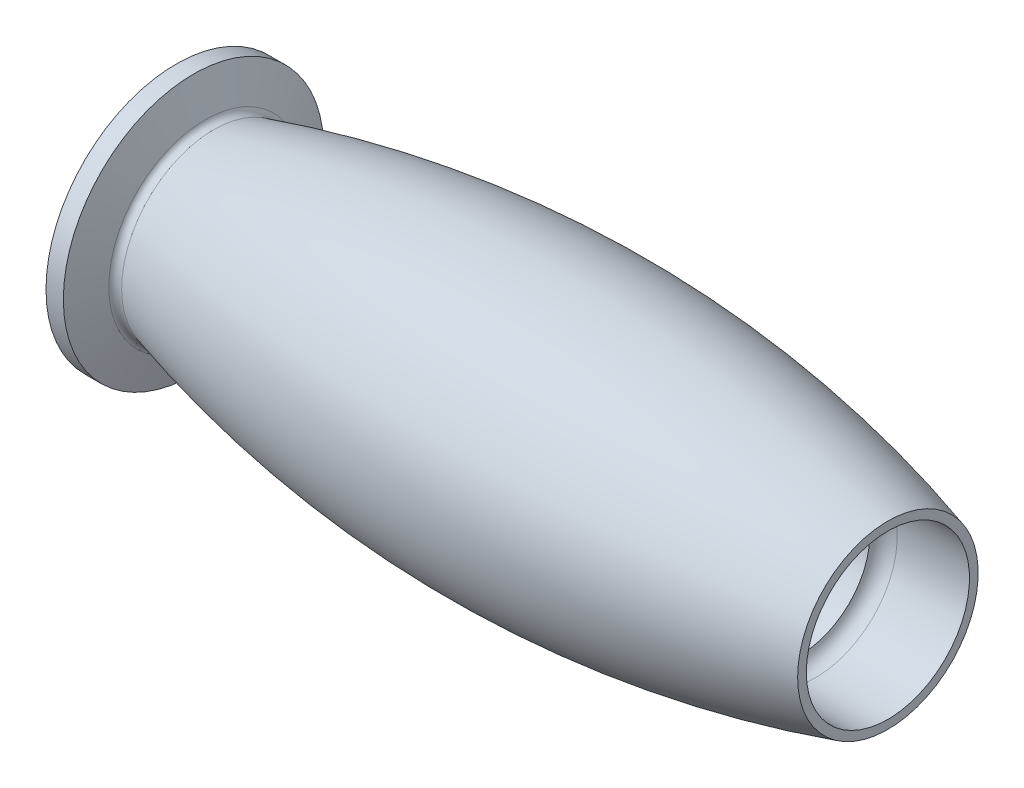
ISO-10303-21;
HEADER;
FILE_DESCRIPTION(('STEP AP214'),'2;1');
FILE_NAME('part.step','',(''),(''),'','','');
FILE_SCHEMA(('AUTOMOTIVE_DESIGN { 1 0 10303 214 1 1 1 1 }'));
ENDSEC;
DATA;
#1=APPLICATION_CONTEXT('core data for automotive mechanical design processes');
#2=APPLICATION_PROTOCOL_DEFINITION('international standard','automotive_design',2000,#1);
#3=PRODUCT_CONTEXT('',#1,'mechanical');
#4=PRODUCT('Part','Part','',(#3));
#5=PRODUCT_RELATED_PRODUCT_CATEGORY('part','',(#4));
#6=PRODUCT_DEFINITION_FORMATION('','',#4);
#7=PRODUCT_DEFINITION_CONTEXT('part definition',#1,'design');
#8=PRODUCT_DEFINITION('design','',#6,#7);
#9=PRODUCT_DEFINITION_SHAPE('','',#8);
#10=(LENGTH_UNIT() NAMED_UNIT(*) SI_UNIT(.MILLI.,.METRE.));
#11=(NAMED_UNIT(*) PLANE_ANGLE_UNIT() SI_UNIT($,.RADIAN.));
#12=(NAMED_UNIT(*) SI_UNIT($,.STERADIAN.) SOLID_ANGLE_UNIT());
#13=UNCERTAINTY_MEASURE_WITH_UNIT(LENGTH_MEASURE(1.E-05),#10,'distance_accuracy_value','');
#14=(GEOMETRIC_REPRESENTATION_CONTEXT(3) GLOBAL_UNCERTAINTY_ASSIGNED_CONTEXT((#13)) GLOBAL_UNIT_ASSIGNED_CONTEXT((#10,
#11,#12)) REPRESENTATION_CONTEXT('',''));
#15=CARTESIAN_POINT('',(0.,0.,0.));
#16=DIRECTION('',(0.,0.,1.));
#17=DIRECTION('',(1.,0.,0.));
#18=AXIS2_PLACEMENT_3D('',#15,#16,#17);
#19=CARTESIAN_POINT('',(-20.,0.,0.));
#20=DIRECTION('',(-1.,0.,0.));
#21=DIRECTION('',(0.,0.,1.));
#22=AXIS2_PLACEMENT_3D('',#19,#20,#21);
#23=CYLINDRICAL_SURFACE('',#22,12.);
#24=CARTESIAN_POINT('',(4.00000000000001,0.,0.));
#25=DIRECTION('',(-1.,0.,0.));
#26=DIRECTION('',(0.,0.,1.));
#27=AXIS2_PLACEMENT_3D('',#24,#25,#26);
#28=CIRCLE('',#27,12.);
#29=CARTESIAN_POINT('',(4.00000000000001,0.,12.));
#30=VERTEX_POINT('',#29);
#31=EDGE_CURVE('E43',#30,#30,#28,.T.);
#32=ORIENTED_EDGE('',*,*,#31,.T.);
#33=EDGE_LOOP('',(#32));
#34=FACE_BOUND('',#33,.T.);
#35=CARTESIAN_POINT('',(7.00000000000001,0.,0.));
#36=DIRECTION('',(-1.,0.,0.));
#37=DIRECTION('',(0.,0.,1.));
#38=AXIS2_PLACEMENT_3D('',#35,#36,#37);
#39=CIRCLE('',#38,12.);
#40=CARTESIAN_POINT('',(7.00000000000001,0.,12.));
#41=VERTEX_POINT('',#40);
#42=EDGE_CURVE('E81',#41,#41,#39,.T.);
#43=ORIENTED_EDGE('',*,*,#42,.F.);
#44=EDGE_LOOP('',(#43));
#45=FACE_BOUND('',#44,.T.);
#46=ADVANCED_FACE('F29',(#34,#45),#23,.F.);
#47=CARTESIAN_POINT('',(4.00000000000001,0.,0.));
#48=DIRECTION('',(1.,0.,0.));
#49=DIRECTION('',(0.,0.,-1.));
#50=AXIS2_PLACEMENT_3D('',#47,#48,#49);
#51=CONICAL_SURFACE('',#50,12.,1.21609067478396);
#52=CARTESIAN_POINT('',(6.50000000000001,0.,0.));
#53=DIRECTION('',(-1.,0.,0.));
#54=DIRECTION('',(0.,0.,1.));
#55=AXIS2_PLACEMENT_3D('',#52,#53,#54);
#56=CIRCLE('',#55,18.75);
#57=CARTESIAN_POINT('',(6.50000000000001,0.,18.75));
#58=VERTEX_POINT('',#57);
#59=EDGE_CURVE('E48',#58,#58,#56,.T.);
#60=ORIENTED_EDGE('',*,*,#59,.T.);
#61=EDGE_LOOP('',(#60));
#62=FACE_BOUND('',#61,.T.);
#63=ORIENTED_EDGE('',*,*,#31,.F.);
#64=EDGE_LOOP('',(#63));
#65=FACE_BOUND('',#64,.T.);
#66=ADVANCED_FACE('F89',(#62,#65),#51,.T.);
#67=CARTESIAN_POINT('',(-20.,0.,0.));
#68=DIRECTION('',(-1.,0.,0.));
#69=DIRECTION('',(0.,0.,1.));
#70=AXIS2_PLACEMENT_3D('',#67,#68,#69);
#71=CYLINDRICAL_SURFACE('',#70,18.75);
#72=CARTESIAN_POINT('',(9.00000000000002,0.,0.));
#73=DIRECTION('',(-1.,0.,0.));
#74=DIRECTION('',(0.,0.,1.));
#75=AXIS2_PLACEMENT_3D('',#72,#73,#74);
#76=CIRCLE('',#75,18.75);
#77=CARTESIAN_POINT('',(9.00000000000002,0.,18.75));
#78=VERTEX_POINT('',#77);
#79=EDGE_CURVE('E51',#78,#78,#76,.T.);
#80=ORIENTED_EDGE('',*,*,#79,.T.);
#81=EDGE_LOOP('',(#80));
#82=FACE_BOUND('',#81,.T.);
#83=ORIENTED_EDGE('',*,*,#59,.F.);
#84=EDGE_LOOP('',(#83));
#85=FACE_BOUND('',#84,.T.);
#86=ADVANCED_FACE('F94',(#82,#85),#71,.T.);
#87=CARTESIAN_POINT('',(9.00000000000002,0.,0.));
#88=DIRECTION('',(-1.,0.,0.));
#89=DIRECTION('',(0.,0.,1.));
#90=AXIS2_PLACEMENT_3D('',#87,#88,#89);
#91=CONICAL_SURFACE('',#90,18.75,1.23605948947808);
#92=CARTESIAN_POINT('',(10.6886470485988,0.,0.));
#93=DIRECTION('',(-1.,0.,0.));
#94=DIRECTION('',(0.,0.,1.));
#95=AXIS2_PLACEMENT_3D('',#92,#93,#94);
#96=CIRCLE('',#95,13.8951397352786);
#97=CARTESIAN_POINT('',(10.6886470485988,0.,13.8951397352786));
#98=VERTEX_POINT('',#97);
#99=EDGE_CURVE('E54',#98,#98,#96,.T.);
#100=ORIENTED_EDGE('',*,*,#99,.T.);
#101=EDGE_LOOP('',(#100));
#102=FACE_BOUND('',#101,.T.);
#103=ORIENTED_EDGE('',*,*,#79,.F.);
#104=EDGE_LOOP('',(#103));
#105=FACE_BOUND('',#104,.T.);
#106=ADVANCED_FACE('F101',(#102,#105),#91,.T.);
#107=CARTESIAN_POINT('',(11.6331438453049,0.,0.));
#108=DIRECTION('',(-1.,0.,0.));
#109=DIRECTION('',(0.,0.,1.));
#110=AXIS2_PLACEMENT_3D('',#107,#108,#109);
#111=TOROIDAL_SURFACE('',#110,14.2236603602199,1.00000000000001);
#112=CARTESIAN_POINT('',(11.907955528002,0.,0.));
#113=DIRECTION('',(-1.,0.,0.));
#114=DIRECTION('',(0.,0.,1.));
#115=AXIS2_PLACEMENT_3D('',#112,#113,#114);
#116=CIRCLE('',#115,13.2621622899913);
#117=CARTESIAN_POINT('',(11.907955528002,0.,13.2621622899913));
#118=VERTEX_POINT('',#117);
#119=EDGE_CURVE('E57',#118,#118,#116,.T.);
#120=ORIENTED_EDGE('',*,*,#119,.T.);
#121=EDGE_LOOP('',(#120));
#122=FACE_BOUND('',#121,.T.);
#123=ORIENTED_EDGE('',*,*,#99,.F.);
#124=EDGE_LOOP('',(#123));
#125=FACE_BOUND('',#124,.T.);
#126=ADVANCED_FACE('F107',(#122,#125),#111,.F.);
#127=CARTESIAN_POINT('',(60.,0.,0.));
#128=DIRECTION('',(-1.,0.,0.));
#129=DIRECTION('',(0.,0.,1.));
#130=AXIS2_PLACEMENT_3D('',#127,#128,#129);
#131=DEGENERATE_TOROIDAL_SURFACE('',#130,155.000000000003,175.000000000003,.F.);
#132=CARTESIAN_POINT('',(109.,0.,0.));
#133=DIRECTION('',(-1.,0.,0.));
#134=DIRECTION('',(0.,0.,1.));
#135=AXIS2_PLACEMENT_3D('',#132,#133,#134);
#136=CIRCLE('',#135,13.);
#137=CARTESIAN_POINT('',(109.,0.,13.));
#138=VERTEX_POINT('',#137);
#139=EDGE_CURVE('E60',#138,#138,#136,.T.);
#140=ORIENTED_EDGE('',*,*,#139,.T.);
#141=EDGE_LOOP('',(#140));
#142=FACE_BOUND('',#141,.T.);
#143=ORIENTED_EDGE('',*,*,#119,.F.);
#144=EDGE_LOOP('',(#143));
#145=FACE_BOUND('',#144,.T.);
#146=ADVANCED_FACE('F111',(#142,#145),#131,.F.);
#147=CARTESIAN_POINT('',(109.,-13.,0.));
#148=DIRECTION('',(1.,0.,0.));
#149=DIRECTION('',(0.,0.,-1.));
#150=AXIS2_PLACEMENT_3D('',#147,#148,#149);
#151=PLANE('',#150);
#152=CARTESIAN_POINT('',(109.,0.,0.));
#153=DIRECTION('',(-1.,0.,0.));
#154=DIRECTION('',(0.,0.,1.));
#155=AXIS2_PLACEMENT_3D('',#152,#153,#154);
#156=CIRCLE('',#155,11.75);
#157=CARTESIAN_POINT('',(109.,0.,11.75));
#158=VERTEX_POINT('',#157);
#159=EDGE_CURVE('E63',#158,#158,#156,.T.);
#160=ORIENTED_EDGE('',*,*,#159,.T.);
#161=EDGE_LOOP('',(#160));
#162=FACE_BOUND('',#161,.T.);
#163=ORIENTED_EDGE('',*,*,#139,.F.);
#164=EDGE_LOOP('',(#163));
#165=FACE_BOUND('',#164,.T.);
#166=ADVANCED_FACE('F115',(#162,#165),#151,.T.);
#167=CARTESIAN_POINT('',(-20.,0.,0.));
#168=DIRECTION('',(-1.,0.,0.));
#169=DIRECTION('',(0.,0.,1.));
#170=AXIS2_PLACEMENT_3D('',#167,#168,#169);
#171=CYLINDRICAL_SURFACE('',#170,11.75);
#172=CARTESIAN_POINT('',(98.593741096848,0.,0.));
#173=DIRECTION('',(-1.,0.,0.));
#174=DIRECTION('',(0.,0.,1.));
#175=AXIS2_PLACEMENT_3D('',#172,#173,#174);
#176=CIRCLE('',#175,11.75);
#177=CARTESIAN_POINT('',(98.593741096848,0.,11.75));
#178=VERTEX_POINT('',#177);
#179=EDGE_CURVE('E10',#178,#178,#176,.T.);
#180=ORIENTED_EDGE('',*,*,#179,.T.);
#181=EDGE_LOOP('',(#180));
#182=FACE_BOUND('',#181,.T.);
#183=ORIENTED_EDGE('',*,*,#159,.F.);
#184=EDGE_LOOP('',(#183));
#185=FACE_BOUND('',#184,.T.);
#186=ADVANCED_FACE('F119',(#182,#185),#171,.F.);
#187=CARTESIAN_POINT('',(-20.,0.,0.));
#188=DIRECTION('',(-1.,0.,0.));
#189=DIRECTION('',(0.,0.,1.));
#190=AXIS2_PLACEMENT_3D('',#187,#188,#189);
#191=CYLINDRICAL_SURFACE('',#190,10.);
#192=CARTESIAN_POINT('',(15.,0.,0.));
#193=DIRECTION('',(-1.,0.,0.));
#194=DIRECTION('',(0.,0.,1.));
#195=AXIS2_PLACEMENT_3D('',#192,#193,#194);
#196=CIRCLE('',#195,10.);
#197=CARTESIAN_POINT('',(15.,0.,9.99999999999999));
#198=VERTEX_POINT('',#197);
#199=EDGE_CURVE('E69',#198,#198,#196,.T.);
#200=ORIENTED_EDGE('',*,*,#199,.T.);
#201=EDGE_LOOP('',(#200));
#202=FACE_BOUND('',#201,.T.);
#203=CARTESIAN_POINT('',(96.4,0.,0.));
#204=DIRECTION('',(-1.,0.,0.));
#205=DIRECTION('',(0.,0.,1.));
#206=AXIS2_PLACEMENT_3D('',#203,#204,#205);
#207=CIRCLE('',#206,10.);
#208=CARTESIAN_POINT('',(96.4,0.,9.99999999999998));
#209=VERTEX_POINT('',#208);
#210=EDGE_CURVE('E66',#209,#209,#207,.T.);
#211=ORIENTED_EDGE('',*,*,#210,.F.);
#212=EDGE_LOOP('',(#211));
#213=FACE_BOUND('',#212,.T.);
#214=ADVANCED_FACE('F123',(#202,#213),#191,.F.);
#215=CARTESIAN_POINT('',(15.,-6.99999999999998,0.));
#216=DIRECTION('',(1.,0.,0.));
#217=DIRECTION('',(0.,0.,-1.));
#218=AXIS2_PLACEMENT_3D('',#215,#216,#217);
#219=PLANE('',#218);
#220=CARTESIAN_POINT('',(15.,0.,0.));
#221=DIRECTION('',(-1.,0.,0.));
#222=DIRECTION('',(0.,0.,1.));
#223=AXIS2_PLACEMENT_3D('',#220,#221,#222);
#224=CIRCLE('',#223,7.);
#225=CARTESIAN_POINT('',(15.,0.,6.99999999999999));
#226=VERTEX_POINT('',#225);
#227=EDGE_CURVE('E72',#226,#226,#224,.T.);
#228=ORIENTED_EDGE('',*,*,#227,.T.);
#229=EDGE_LOOP('',(#228));
#230=FACE_BOUND('',#229,.T.);
#231=ORIENTED_EDGE('',*,*,#199,.F.);
#232=EDGE_LOOP('',(#231));
#233=FACE_BOUND('',#232,.T.);
#234=ADVANCED_FACE('F126',(#230,#233),#219,.T.);
#235=CARTESIAN_POINT('',(-20.,0.,0.));
#236=DIRECTION('',(-1.,0.,0.));
#237=DIRECTION('',(0.,0.,1.));
#238=AXIS2_PLACEMENT_3D('',#235,#236,#237);
#239=CYLINDRICAL_SURFACE('',#238,7.);
#240=CARTESIAN_POINT('',(13.,0.,0.));
#241=DIRECTION('',(-1.,0.,0.));
#242=DIRECTION('',(0.,0.,1.));
#243=AXIS2_PLACEMENT_3D('',#240,#241,#242);
#244=CIRCLE('',#243,7.);
#245=CARTESIAN_POINT('',(13.,0.,6.99999999999999));
#246=VERTEX_POINT('',#245);
#247=EDGE_CURVE('E75',#246,#246,#244,.T.);
#248=ORIENTED_EDGE('',*,*,#247,.T.);
#249=EDGE_LOOP('',(#248));
#250=FACE_BOUND('',#249,.T.);
#251=ORIENTED_EDGE('',*,*,#227,.F.);
#252=EDGE_LOOP('',(#251));
#253=FACE_BOUND('',#252,.T.);
#254=ADVANCED_FACE('F130',(#250,#253),#239,.F.);
#255=CARTESIAN_POINT('',(13.,-11.75,0.));
#256=DIRECTION('',(-1.,0.,0.));
#257=DIRECTION('',(0.,0.,1.));
#258=AXIS2_PLACEMENT_3D('',#255,#256,#257);
#259=PLANE('',#258);
#260=CARTESIAN_POINT('',(13.,0.,0.));
#261=DIRECTION('',(-1.,0.,0.));
#262=DIRECTION('',(0.,0.,1.));
#263=AXIS2_PLACEMENT_3D('',#260,#261,#262);
#264=CIRCLE('',#263,9.5);
#265=CARTESIAN_POINT('',(13.,0.,9.49999999999999));
#266=VERTEX_POINT('',#265);
#267=EDGE_CURVE('E39',#266,#266,#264,.T.);
#268=ORIENTED_EDGE('',*,*,#267,.T.);
#269=EDGE_LOOP('',(#268));
#270=FACE_BOUND('',#269,.T.);
#271=ORIENTED_EDGE('',*,*,#247,.F.);
#272=EDGE_LOOP('',(#271));
#273=FACE_BOUND('',#272,.T.);
#274=ADVANCED_FACE('F134',(#270,#273),#259,.T.);
#275=CARTESIAN_POINT('',(-20.,0.,0.));
#276=DIRECTION('',(-1.,0.,0.));
#277=DIRECTION('',(0.,0.,1.));
#278=AXIS2_PLACEMENT_3D('',#275,#276,#277);
#279=CYLINDRICAL_SURFACE('',#278,11.75);
#280=CARTESIAN_POINT('',(10.75,0.,0.));
#281=DIRECTION('',(-1.,0.,0.));
#282=DIRECTION('',(0.,0.,1.));
#283=AXIS2_PLACEMENT_3D('',#280,#281,#282);
#284=CIRCLE('',#283,11.75);
#285=CARTESIAN_POINT('',(10.75,0.,11.75));
#286=VERTEX_POINT('',#285);
#287=EDGE_CURVE('E35',#286,#286,#284,.F.);
#288=ORIENTED_EDGE('',*,*,#287,.T.);
#289=EDGE_LOOP('',(#288));
#290=FACE_BOUND('',#289,.T.);
#291=CARTESIAN_POINT('',(7.00000000000001,0.,0.));
#292=DIRECTION('',(-1.,0.,0.));
#293=DIRECTION('',(0.,0.,1.));
#294=AXIS2_PLACEMENT_3D('',#291,#292,#293);
#295=CIRCLE('',#294,11.75);
#296=CARTESIAN_POINT('',(7.00000000000001,0.,11.75));
#297=VERTEX_POINT('',#296);
#298=EDGE_CURVE('E78',#297,#297,#295,.T.);
#299=ORIENTED_EDGE('',*,*,#298,.T.);
#300=EDGE_LOOP('',(#299));
#301=FACE_BOUND('',#300,.T.);
#302=ADVANCED_FACE('F138',(#290,#301),#279,.F.);
#303=CARTESIAN_POINT('',(7.00000000000001,-12.,0.));
#304=DIRECTION('',(-1.,0.,0.));
#305=DIRECTION('',(0.,0.,1.));
#306=AXIS2_PLACEMENT_3D('',#303,#304,#305);
#307=PLANE('',#306);
#308=ORIENTED_EDGE('',*,*,#42,.T.);
#309=EDGE_LOOP('',(#308));
#310=FACE_BOUND('',#309,.T.);
#311=ORIENTED_EDGE('',*,*,#298,.F.);
#312=EDGE_LOOP('',(#311));
#313=FACE_BOUND('',#312,.T.);
#314=ADVANCED_FACE('F85',(#310,#313),#307,.T.);
#315=CARTESIAN_POINT('',(10.75,0.,0.));
#316=DIRECTION('',(-1.,0.,0.));
#317=DIRECTION('',(0.,0.,1.));
#318=AXIS2_PLACEMENT_3D('',#315,#316,#317);
#319=TOROIDAL_SURFACE('',#318,9.5,2.25);
#320=ORIENTED_EDGE('',*,*,#287,.F.);
#321=EDGE_LOOP('',(#320));
#322=FACE_BOUND('',#321,.T.);
#323=ORIENTED_EDGE('',*,*,#267,.F.);
#324=EDGE_LOOP('',(#323));
#325=FACE_BOUND('',#324,.T.);
#326=ADVANCED_FACE('F144',(#322,#325),#319,.F.);
#327=CARTESIAN_POINT('',(98.593741096848,0.,0.));
#328=DIRECTION('',(-1.,0.,0.));
#329=DIRECTION('',(0.,0.,1.));
#330=AXIS2_PLACEMENT_3D('',#327,#328,#329);
#331=TOROIDAL_SURFACE('',#330,9.5,2.25);
#332=ORIENTED_EDGE('',*,*,#210,.T.);
#333=EDGE_LOOP('',(#332));
#334=FACE_BOUND('',#333,.T.);
#335=ORIENTED_EDGE('',*,*,#179,.F.);
#336=EDGE_LOOP('',(#335));
#337=FACE_BOUND('',#336,.T.);
#338=ADVANCED_FACE('F147',(#334,#337),#331,.F.);
#339=CLOSED_SHELL('',(#46,#66,#86,#106,#126,#146,#166,#186,#214,#234,#254,#274,#302,#314,#326,#338));
#340=MANIFOLD_SOLID_BREP('B2',#339);
#341=ADVANCED_BREP_SHAPE_REPRESENTATION('',(#18,#340),#14);
#342=SHAPE_DEFINITION_REPRESENTATION(#9,#341);
ENDSEC;
END-ISO-10303-21;
